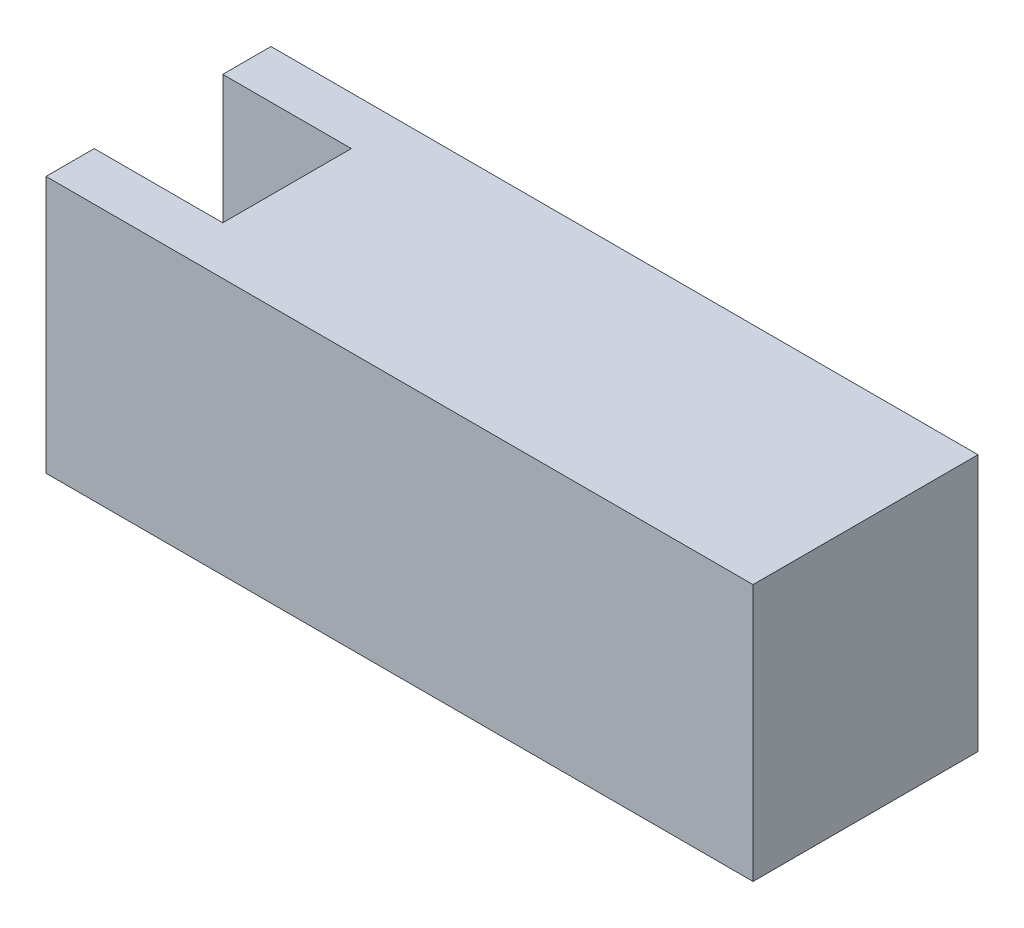
ISO-10303-21;
HEADER;
FILE_DESCRIPTION(('STEP AP214'),'2;1');
FILE_NAME('part.step','',(''),(''),'','','');
FILE_SCHEMA(('AUTOMOTIVE_DESIGN { 1 0 10303 214 1 1 1 1 }'));
ENDSEC;
DATA;
#1=APPLICATION_CONTEXT('core data for automotive mechanical design processes');
#2=APPLICATION_PROTOCOL_DEFINITION('international standard','automotive_design',2000,#1);
#3=PRODUCT_CONTEXT('',#1,'mechanical');
#4=PRODUCT('Part','Part','',(#3));
#5=PRODUCT_RELATED_PRODUCT_CATEGORY('part','',(#4));
#6=PRODUCT_DEFINITION_FORMATION('','',#4);
#7=PRODUCT_DEFINITION_CONTEXT('part definition',#1,'design');
#8=PRODUCT_DEFINITION('design','',#6,#7);
#9=PRODUCT_DEFINITION_SHAPE('','',#8);
#10=(LENGTH_UNIT() NAMED_UNIT(*) SI_UNIT(.MILLI.,.METRE.));
#11=(NAMED_UNIT(*) PLANE_ANGLE_UNIT() SI_UNIT($,.RADIAN.));
#12=(NAMED_UNIT(*) SI_UNIT($,.STERADIAN.) SOLID_ANGLE_UNIT());
#13=UNCERTAINTY_MEASURE_WITH_UNIT(LENGTH_MEASURE(1.E-05),#10,'distance_accuracy_value','');
#14=(GEOMETRIC_REPRESENTATION_CONTEXT(3) GLOBAL_UNCERTAINTY_ASSIGNED_CONTEXT((#13)) GLOBAL_UNIT_ASSIGNED_CONTEXT((#10,
#11,#12)) REPRESENTATION_CONTEXT('',''));
#15=CARTESIAN_POINT('',(0.,0.,0.));
#16=DIRECTION('',(0.,0.,1.));
#17=DIRECTION('',(1.,0.,0.));
#18=AXIS2_PLACEMENT_3D('',#15,#16,#17);
#19=CARTESIAN_POINT('',(-13.97,0.,4.445));
#20=DIRECTION('',(1.,0.,0.));
#21=DIRECTION('',(0.,0.,-1.));
#22=AXIS2_PLACEMENT_3D('',#19,#20,#21);
#23=PLANE('',#22);
#24=DIRECTION('',(0.,0.,-1.));
#25=VECTOR('',#24,1.);
#26=CARTESIAN_POINT('',(-13.97,0.,4.445));
#27=LINE('',#26,#25);
#28=CARTESIAN_POINT('',(-13.97,0.,0.9525));
#29=VERTEX_POINT('',#28);
#30=CARTESIAN_POINT('',(-13.97,0.,0.));
#31=VERTEX_POINT('',#30);
#32=EDGE_CURVE('E171',#29,#31,#27,.T.);
#33=ORIENTED_EDGE('',*,*,#32,.F.);
#34=DIRECTION('',(0.,-1.,0.));
#35=VECTOR('',#34,1.);
#36=CARTESIAN_POINT('',(-13.97,0.,0.9525));
#37=LINE('',#36,#35);
#38=CARTESIAN_POINT('',(-13.97,5.08,0.9525));
#39=VERTEX_POINT('',#38);
#40=EDGE_CURVE('E184',#39,#29,#37,.T.);
#41=ORIENTED_EDGE('',*,*,#40,.F.);
#42=DIRECTION('',(0.,0.,-1.));
#43=VECTOR('',#42,1.);
#44=CARTESIAN_POINT('',(-13.97,5.08,4.445));
#45=LINE('',#44,#43);
#46=CARTESIAN_POINT('',(-13.97,5.08,0.));
#47=VERTEX_POINT('',#46);
#48=EDGE_CURVE('E173',#39,#47,#45,.T.);
#49=ORIENTED_EDGE('',*,*,#48,.T.);
#50=DIRECTION('',(0.,-1.,0.));
#51=VECTOR('',#50,1.);
#52=CARTESIAN_POINT('',(-13.97,0.,0.));
#53=LINE('',#52,#51);
#54=EDGE_CURVE('E163',#47,#31,#53,.T.);
#55=ORIENTED_EDGE('',*,*,#54,.T.);
#56=EDGE_LOOP('',(#33,#41,#49,#55));
#57=FACE_BOUND('',#56,.T.);
#58=ADVANCED_FACE('F39',(#57),#23,.F.);
#59=CARTESIAN_POINT('',(0.,0.,4.445));
#60=DIRECTION('',(-1.,0.,0.));
#61=DIRECTION('',(0.,0.,1.));
#62=AXIS2_PLACEMENT_3D('',#59,#60,#61);
#63=PLANE('',#62);
#64=DIRECTION('',(0.,1.,0.));
#65=VECTOR('',#64,1.);
#66=CARTESIAN_POINT('',(0.,0.,0.));
#67=LINE('',#66,#65);
#68=CARTESIAN_POINT('',(0.,0.,0.));
#69=VERTEX_POINT('',#68);
#70=CARTESIAN_POINT('',(0.,5.08,0.));
#71=VERTEX_POINT('',#70);
#72=EDGE_CURVE('E155',#69,#71,#67,.T.);
#73=ORIENTED_EDGE('',*,*,#72,.T.);
#74=DIRECTION('',(0.,0.,-1.));
#75=VECTOR('',#74,1.);
#76=CARTESIAN_POINT('',(0.,5.08,4.445));
#77=LINE('',#76,#75);
#78=CARTESIAN_POINT('',(0.,5.08,4.445));
#79=VERTEX_POINT('',#78);
#80=EDGE_CURVE('E11',#79,#71,#77,.T.);
#81=ORIENTED_EDGE('',*,*,#80,.F.);
#82=DIRECTION('',(0.,1.,0.));
#83=VECTOR('',#82,1.);
#84=CARTESIAN_POINT('',(0.,0.,4.445));
#85=LINE('',#84,#83);
#86=CARTESIAN_POINT('',(0.,0.,4.445));
#87=VERTEX_POINT('',#86);
#88=EDGE_CURVE('E144',#87,#79,#85,.T.);
#89=ORIENTED_EDGE('',*,*,#88,.F.);
#90=DIRECTION('',(0.,0.,-1.));
#91=VECTOR('',#90,1.);
#92=CARTESIAN_POINT('',(0.,0.,4.445));
#93=LINE('',#92,#91);
#94=EDGE_CURVE('E154',#87,#69,#93,.T.);
#95=ORIENTED_EDGE('',*,*,#94,.T.);
#96=EDGE_LOOP('',(#73,#81,#89,#95));
#97=FACE_BOUND('',#96,.T.);
#98=ADVANCED_FACE('F41',(#97),#63,.F.);
#99=CARTESIAN_POINT('',(0.,5.08,4.445));
#100=DIRECTION('',(0.,-1.,0.));
#101=DIRECTION('',(1.,0.,0.));
#102=AXIS2_PLACEMENT_3D('',#99,#100,#101);
#103=PLANE('',#102);
#104=ORIENTED_EDGE('',*,*,#48,.F.);
#105=DIRECTION('',(-1.,0.,0.));
#106=VECTOR('',#105,1.);
#107=CARTESIAN_POINT('',(-11.43,5.08,0.9525));
#108=LINE('',#107,#106);
#109=CARTESIAN_POINT('',(-11.43,5.08,0.9525));
#110=VERTEX_POINT('',#109);
#111=EDGE_CURVE('E139',#110,#39,#108,.T.);
#112=ORIENTED_EDGE('',*,*,#111,.F.);
#113=DIRECTION('',(0.,0.,-1.));
#114=VECTOR('',#113,1.);
#115=CARTESIAN_POINT('',(-11.43,5.08,0.9525));
#116=LINE('',#115,#114);
#117=CARTESIAN_POINT('',(-11.43,5.08,3.4925));
#118=VERTEX_POINT('',#117);
#119=EDGE_CURVE('E122',#118,#110,#116,.T.);
#120=ORIENTED_EDGE('',*,*,#119,.F.);
#121=DIRECTION('',(-1.,0.,0.));
#122=VECTOR('',#121,1.);
#123=CARTESIAN_POINT('',(-11.43,5.08,3.4925));
#124=LINE('',#123,#122);
#125=CARTESIAN_POINT('',(-13.97,5.08,3.4925));
#126=VERTEX_POINT('',#125);
#127=EDGE_CURVE('E119',#118,#126,#124,.T.);
#128=ORIENTED_EDGE('',*,*,#127,.T.);
#129=CARTESIAN_POINT('',(-13.97,5.08,4.445));
#130=VERTEX_POINT('',#129);
#131=EDGE_CURVE('E48',#130,#126,#45,.T.);
#132=ORIENTED_EDGE('',*,*,#131,.F.);
#133=DIRECTION('',(-1.,0.,0.));
#134=VECTOR('',#133,1.);
#135=CARTESIAN_POINT('',(0.,5.08,4.445));
#136=LINE('',#135,#134);
#137=EDGE_CURVE('E91',#79,#130,#136,.T.);
#138=ORIENTED_EDGE('',*,*,#137,.F.);
#139=ORIENTED_EDGE('',*,*,#80,.T.);
#140=DIRECTION('',(-1.,0.,0.));
#141=VECTOR('',#140,1.);
#142=CARTESIAN_POINT('',(0.,5.08,0.));
#143=LINE('',#142,#141);
#144=EDGE_CURVE('E159',#71,#47,#143,.T.);
#145=ORIENTED_EDGE('',*,*,#144,.T.);
#146=EDGE_LOOP('',(#104,#112,#120,#128,#132,#138,#139,#145));
#147=FACE_BOUND('',#146,.T.);
#148=ADVANCED_FACE('F186',(#147),#103,.F.);
#149=ORIENTED_EDGE('',*,*,#131,.T.);
#150=DIRECTION('',(0.,1.,0.));
#151=VECTOR('',#150,1.);
#152=CARTESIAN_POINT('',(-13.97,0.,3.4925));
#153=LINE('',#152,#151);
#154=CARTESIAN_POINT('',(-13.97,0.,3.4925));
#155=VERTEX_POINT('',#154);
#156=EDGE_CURVE('E195',#155,#126,#153,.T.);
#157=ORIENTED_EDGE('',*,*,#156,.F.);
#158=CARTESIAN_POINT('',(-13.97,0.,4.445));
#159=VERTEX_POINT('',#158);
#160=EDGE_CURVE('E133',#159,#155,#27,.T.);
#161=ORIENTED_EDGE('',*,*,#160,.F.);
#162=DIRECTION('',(0.,-1.,0.));
#163=VECTOR('',#162,1.);
#164=CARTESIAN_POINT('',(-13.97,0.,4.445));
#165=LINE('',#164,#163);
#166=EDGE_CURVE('E149',#130,#159,#165,.T.);
#167=ORIENTED_EDGE('',*,*,#166,.F.);
#168=EDGE_LOOP('',(#149,#157,#161,#167));
#169=FACE_BOUND('',#168,.T.);
#170=ADVANCED_FACE('F194',(#169),#23,.F.);
#171=CARTESIAN_POINT('',(0.,0.,4.445));
#172=DIRECTION('',(0.,1.,0.));
#173=DIRECTION('',(-1.,0.,0.));
#174=AXIS2_PLACEMENT_3D('',#171,#172,#173);
#175=PLANE('',#174);
#176=DIRECTION('',(0.,0.,1.));
#177=VECTOR('',#176,1.);
#178=CARTESIAN_POINT('',(-11.43,0.,0.9525));
#179=LINE('',#178,#177);
#180=CARTESIAN_POINT('',(-11.43,0.,0.9525));
#181=VERTEX_POINT('',#180);
#182=CARTESIAN_POINT('',(-11.43,0.,3.4925));
#183=VERTEX_POINT('',#182);
#184=EDGE_CURVE('E123',#181,#183,#179,.T.);
#185=ORIENTED_EDGE('',*,*,#184,.F.);
#186=DIRECTION('',(-1.,0.,0.));
#187=VECTOR('',#186,1.);
#188=CARTESIAN_POINT('',(-11.43,0.,0.9525));
#189=LINE('',#188,#187);
#190=EDGE_CURVE('E135',#181,#29,#189,.T.);
#191=ORIENTED_EDGE('',*,*,#190,.T.);
#192=ORIENTED_EDGE('',*,*,#32,.T.);
#193=DIRECTION('',(1.,0.,0.));
#194=VECTOR('',#193,1.);
#195=CARTESIAN_POINT('',(0.,0.,0.));
#196=LINE('',#195,#194);
#197=EDGE_CURVE('E84',#31,#69,#196,.T.);
#198=ORIENTED_EDGE('',*,*,#197,.T.);
#199=ORIENTED_EDGE('',*,*,#94,.F.);
#200=DIRECTION('',(1.,0.,0.));
#201=VECTOR('',#200,1.);
#202=CARTESIAN_POINT('',(0.,0.,4.445));
#203=LINE('',#202,#201);
#204=EDGE_CURVE('E64',#159,#87,#203,.T.);
#205=ORIENTED_EDGE('',*,*,#204,.F.);
#206=ORIENTED_EDGE('',*,*,#160,.T.);
#207=DIRECTION('',(-1.,0.,0.));
#208=VECTOR('',#207,1.);
#209=CARTESIAN_POINT('',(-11.43,0.,3.4925));
#210=LINE('',#209,#208);
#211=EDGE_CURVE('E116',#183,#155,#210,.T.);
#212=ORIENTED_EDGE('',*,*,#211,.F.);
#213=EDGE_LOOP('',(#185,#191,#192,#198,#199,#205,#206,#212));
#214=FACE_BOUND('',#213,.T.);
#215=ADVANCED_FACE('F131',(#214),#175,.F.);
#216=CARTESIAN_POINT('',(0.,0.,4.445));
#217=DIRECTION('',(0.,0.,1.));
#218=DIRECTION('',(1.,0.,0.));
#219=AXIS2_PLACEMENT_3D('',#216,#217,#218);
#220=PLANE('',#219);
#221=ORIENTED_EDGE('',*,*,#88,.T.);
#222=ORIENTED_EDGE('',*,*,#137,.T.);
#223=ORIENTED_EDGE('',*,*,#166,.T.);
#224=ORIENTED_EDGE('',*,*,#204,.T.);
#225=EDGE_LOOP('',(#221,#222,#223,#224));
#226=FACE_BOUND('',#225,.T.);
#227=ADVANCED_FACE('F193',(#226),#220,.T.);
#228=CARTESIAN_POINT('',(0.,0.,0.));
#229=DIRECTION('',(0.,0.,1.));
#230=DIRECTION('',(1.,0.,0.));
#231=AXIS2_PLACEMENT_3D('',#228,#229,#230);
#232=PLANE('',#231);
#233=ORIENTED_EDGE('',*,*,#72,.F.);
#234=ORIENTED_EDGE('',*,*,#197,.F.);
#235=ORIENTED_EDGE('',*,*,#54,.F.);
#236=ORIENTED_EDGE('',*,*,#144,.F.);
#237=EDGE_LOOP('',(#233,#234,#235,#236));
#238=FACE_BOUND('',#237,.T.);
#239=ADVANCED_FACE('F190',(#238),#232,.F.);
#240=CARTESIAN_POINT('',(-11.43,0.,0.9525));
#241=DIRECTION('',(0.,0.,-1.));
#242=DIRECTION('',(-1.,0.,0.));
#243=AXIS2_PLACEMENT_3D('',#240,#241,#242);
#244=PLANE('',#243);
#245=ORIENTED_EDGE('',*,*,#40,.T.);
#246=ORIENTED_EDGE('',*,*,#190,.F.);
#247=DIRECTION('',(0.,-1.,0.));
#248=VECTOR('',#247,1.);
#249=CARTESIAN_POINT('',(-11.43,0.,0.9525));
#250=LINE('',#249,#248);
#251=EDGE_CURVE('E55',#110,#181,#250,.T.);
#252=ORIENTED_EDGE('',*,*,#251,.F.);
#253=ORIENTED_EDGE('',*,*,#111,.T.);
#254=EDGE_LOOP('',(#245,#246,#252,#253));
#255=FACE_BOUND('',#254,.T.);
#256=ADVANCED_FACE('F205',(#255),#244,.F.);
#257=CARTESIAN_POINT('',(-11.43,0.,3.4925));
#258=DIRECTION('',(0.,0.,1.));
#259=DIRECTION('',(1.,0.,0.));
#260=AXIS2_PLACEMENT_3D('',#257,#258,#259);
#261=PLANE('',#260);
#262=ORIENTED_EDGE('',*,*,#156,.T.);
#263=ORIENTED_EDGE('',*,*,#127,.F.);
#264=DIRECTION('',(0.,1.,0.));
#265=VECTOR('',#264,1.);
#266=CARTESIAN_POINT('',(-11.43,0.,3.4925));
#267=LINE('',#266,#265);
#268=EDGE_CURVE('E113',#183,#118,#267,.T.);
#269=ORIENTED_EDGE('',*,*,#268,.F.);
#270=ORIENTED_EDGE('',*,*,#211,.T.);
#271=EDGE_LOOP('',(#262,#263,#269,#270));
#272=FACE_BOUND('',#271,.T.);
#273=ADVANCED_FACE('F114',(#272),#261,.F.);
#274=CARTESIAN_POINT('',(-11.43,0.,0.));
#275=DIRECTION('',(1.,0.,0.));
#276=DIRECTION('',(0.,0.,-1.));
#277=AXIS2_PLACEMENT_3D('',#274,#275,#276);
#278=PLANE('',#277);
#279=ORIENTED_EDGE('',*,*,#251,.T.);
#280=ORIENTED_EDGE('',*,*,#184,.T.);
#281=ORIENTED_EDGE('',*,*,#268,.T.);
#282=ORIENTED_EDGE('',*,*,#119,.T.);
#283=EDGE_LOOP('',(#279,#280,#281,#282));
#284=FACE_BOUND('',#283,.T.);
#285=ADVANCED_FACE('F126',(#284),#278,.F.);
#286=CLOSED_SHELL('',(#58,#98,#148,#170,#215,#227,#239,#256,#273,#285));
#287=MANIFOLD_SOLID_BREP('B2',#286);
#288=ADVANCED_BREP_SHAPE_REPRESENTATION('',(#18,#287),#14);
#289=SHAPE_DEFINITION_REPRESENTATION(#9,#288);
ENDSEC;
END-ISO-10303-21;
